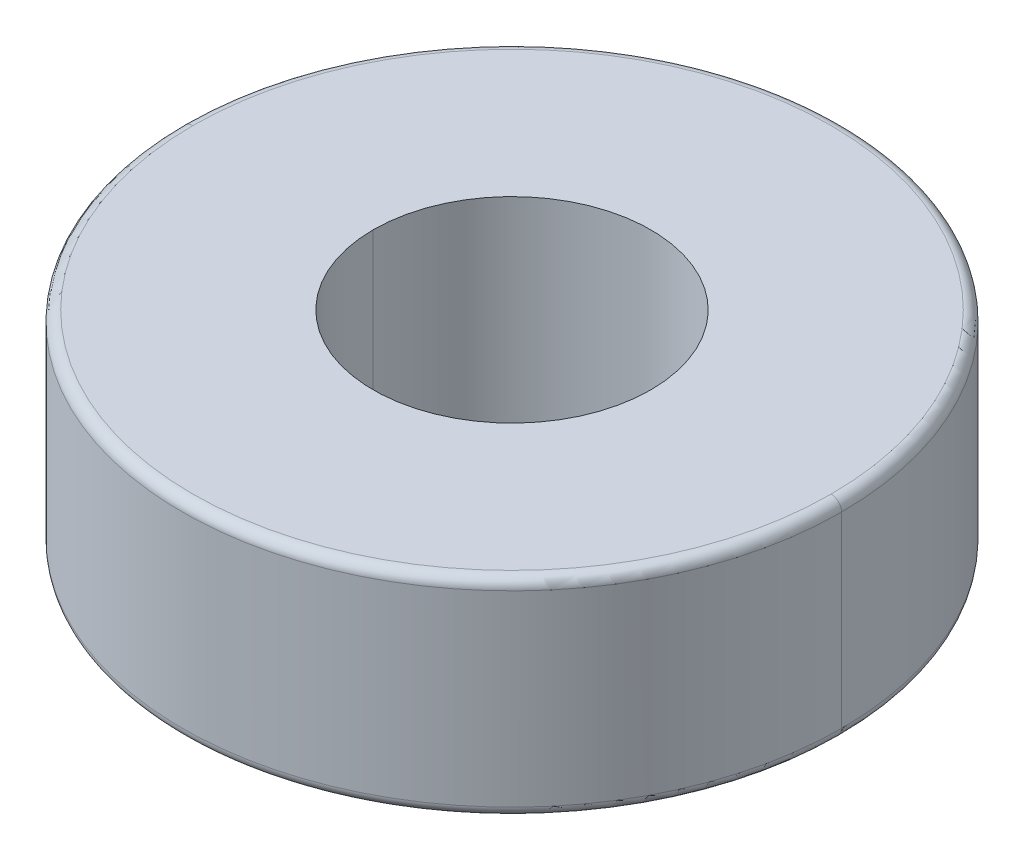
ISO-10303-21;
HEADER;
FILE_DESCRIPTION(('STEP AP214'),'2;1');
FILE_NAME('part.step','',(''),(''),'','','');
FILE_SCHEMA(('AUTOMOTIVE_DESIGN { 1 0 10303 214 1 1 1 1 }'));
ENDSEC;
DATA;
#1=APPLICATION_CONTEXT('core data for automotive mechanical design processes');
#2=APPLICATION_PROTOCOL_DEFINITION('international standard','automotive_design',2000,#1);
#3=PRODUCT_CONTEXT('',#1,'mechanical');
#4=PRODUCT('Part','Part','',(#3));
#5=PRODUCT_RELATED_PRODUCT_CATEGORY('part','',(#4));
#6=PRODUCT_DEFINITION_FORMATION('','',#4);
#7=PRODUCT_DEFINITION_CONTEXT('part definition',#1,'design');
#8=PRODUCT_DEFINITION('design','',#6,#7);
#9=PRODUCT_DEFINITION_SHAPE('','',#8);
#10=(LENGTH_UNIT() NAMED_UNIT(*) SI_UNIT(.MILLI.,.METRE.));
#11=(NAMED_UNIT(*) PLANE_ANGLE_UNIT() SI_UNIT($,.RADIAN.));
#12=(NAMED_UNIT(*) SI_UNIT($,.STERADIAN.) SOLID_ANGLE_UNIT());
#13=UNCERTAINTY_MEASURE_WITH_UNIT(LENGTH_MEASURE(1.E-05),#10,'distance_accuracy_value','');
#14=(GEOMETRIC_REPRESENTATION_CONTEXT(3) GLOBAL_UNCERTAINTY_ASSIGNED_CONTEXT((#13)) GLOBAL_UNIT_ASSIGNED_CONTEXT((#10,
#11,#12)) REPRESENTATION_CONTEXT('',''));
#15=CARTESIAN_POINT('',(0.,0.,0.));
#16=DIRECTION('',(0.,0.,1.));
#17=DIRECTION('',(1.,0.,0.));
#18=AXIS2_PLACEMENT_3D('',#15,#16,#17);
#19=CARTESIAN_POINT('',(0.,0.,0.));
#20=DIRECTION('',(0.,1.,0.));
#21=DIRECTION('',(1.,0.,0.));
#22=AXIS2_PLACEMENT_3D('',#19,#20,#21);
#23=PLANE('',#22);
#24=CARTESIAN_POINT('',(0.,0.,0.));
#25=DIRECTION('',(0.,1.,0.));
#26=DIRECTION('',(0.999979964590323,0.,-0.00633011989901915));
#27=AXIS2_PLACEMENT_3D('',#24,#25,#26);
#28=CIRCLE('',#27,9.2);
#29=CARTESIAN_POINT('',(9.199815674231,0.,-0.05823710307097));
#30=VERTEX_POINT('',#29);
#31=CARTESIAN_POINT('',(-9.2,0.,0.));
#32=VERTEX_POINT('',#31);
#33=EDGE_CURVE('E41',#30,#32,#28,.T.);
#34=ORIENTED_EDGE('',*,*,#33,.F.);
#35=CARTESIAN_POINT('',(0.,0.,0.));
#36=DIRECTION('',(0.,-1.,0.));
#37=DIRECTION('',(0.999979964590323,0.,-0.00633011989901915));
#38=AXIS2_PLACEMENT_3D('',#35,#36,#37);
#39=CIRCLE('',#38,9.2);
#40=CARTESIAN_POINT('',(9.2,0.,0.));
#41=VERTEX_POINT('',#40);
#42=EDGE_CURVE('E11',#30,#41,#39,.T.);
#43=ORIENTED_EDGE('',*,*,#42,.T.);
#44=CARTESIAN_POINT('',(0.,0.,0.));
#45=DIRECTION('',(0.,1.,0.));
#46=DIRECTION('',(-0.999979964590323,0.,0.00633011989901915));
#47=AXIS2_PLACEMENT_3D('',#44,#45,#46);
#48=CIRCLE('',#47,9.2);
#49=CARTESIAN_POINT('',(-9.199815674231,0.,0.05823710307097));
#50=VERTEX_POINT('',#49);
#51=EDGE_CURVE('E162',#50,#41,#48,.T.);
#52=ORIENTED_EDGE('',*,*,#51,.F.);
#53=CARTESIAN_POINT('',(0.,0.,0.));
#54=DIRECTION('',(0.,-1.,0.));
#55=DIRECTION('',(-0.999979964590323,0.,0.00633011989901915));
#56=AXIS2_PLACEMENT_3D('',#53,#54,#55);
#57=CIRCLE('',#56,9.2);
#58=EDGE_CURVE('E28',#50,#32,#57,.T.);
#59=ORIENTED_EDGE('',*,*,#58,.T.);
#60=EDGE_LOOP('',(#34,#43,#52,#59));
#61=FACE_BOUND('',#60,.T.);
#62=CARTESIAN_POINT('',(0.,0.,0.));
#63=DIRECTION('',(0.,-1.,0.));
#64=DIRECTION('',(-1.,0.,0.));
#65=AXIS2_PLACEMENT_3D('',#62,#63,#64);
#66=CIRCLE('',#65,4.);
#67=CARTESIAN_POINT('',(-4.,0.,0.));
#68=VERTEX_POINT('',#67);
#69=CARTESIAN_POINT('',(4.,0.,0.));
#70=VERTEX_POINT('',#69);
#71=EDGE_CURVE('E96',#68,#70,#66,.T.);
#72=ORIENTED_EDGE('',*,*,#71,.F.);
#73=CARTESIAN_POINT('',(0.,0.,0.));
#74=DIRECTION('',(0.,-1.,0.));
#75=DIRECTION('',(1.,0.,0.));
#76=AXIS2_PLACEMENT_3D('',#73,#74,#75);
#77=CIRCLE('',#76,4.);
#78=EDGE_CURVE('E198',#70,#68,#77,.T.);
#79=ORIENTED_EDGE('',*,*,#78,.F.);
#80=EDGE_LOOP('',(#72,#79));
#81=FACE_BOUND('',#80,.T.);
#82=ADVANCED_FACE('F17',(#61,#81),#23,.F.);
#83=CARTESIAN_POINT('',(0.,0.3,0.));
#84=DIRECTION('',(0.,1.,0.));
#85=DIRECTION('',(0.999979964313152,0.,-0.0063301636840707));
#86=AXIS2_PLACEMENT_3D('',#83,#84,#85);
#87=TOROIDAL_SURFACE('',#86,9.2,0.3);
#88=CARTESIAN_POINT('',(9.2,0.3,0.));
#89=DIRECTION('',(0.,0.,-1.));
#90=DIRECTION('',(1.,0.,0.));
#91=AXIS2_PLACEMENT_3D('',#88,#89,#90);
#92=CIRCLE('',#91,0.3);
#93=CARTESIAN_POINT('',(9.5,0.3,0.));
#94=VERTEX_POINT('',#93);
#95=EDGE_CURVE('E177',#94,#41,#92,.T.);
#96=ORIENTED_EDGE('',*,*,#95,.F.);
#97=CARTESIAN_POINT('',(0.,0.3,0.));
#98=DIRECTION('',(0.,1.,0.));
#99=DIRECTION('',(-0.999979964313152,0.,0.0063301636840697));
#100=AXIS2_PLACEMENT_3D('',#97,#98,#99);
#101=CIRCLE('',#100,9.5);
#102=CARTESIAN_POINT('',(-9.499809660975,0.3,0.06013655499867));
#103=VERTEX_POINT('',#102);
#104=EDGE_CURVE('E107',#103,#94,#101,.T.);
#105=ORIENTED_EDGE('',*,*,#104,.F.);
#106=CARTESIAN_POINT('',(0.,0.3,0.));
#107=DIRECTION('',(0.,1.,0.));
#108=DIRECTION('',(-1.,0.,0.));
#109=AXIS2_PLACEMENT_3D('',#106,#107,#108);
#110=CIRCLE('',#109,9.5);
#111=CARTESIAN_POINT('',(-9.5,0.3,1.125604273206E-13));
#112=VERTEX_POINT('',#111);
#113=EDGE_CURVE('E144',#112,#103,#110,.T.);
#114=ORIENTED_EDGE('',*,*,#113,.F.);
#115=CARTESIAN_POINT('',(-9.2,0.3,0.));
#116=DIRECTION('',(0.,0.,1.));
#117=DIRECTION('',(-1.,0.,0.));
#118=AXIS2_PLACEMENT_3D('',#115,#116,#117);
#119=CIRCLE('',#118,0.3);
#120=EDGE_CURVE('E148',#112,#32,#119,.T.);
#121=ORIENTED_EDGE('',*,*,#120,.T.);
#122=ORIENTED_EDGE('',*,*,#58,.F.);
#123=ORIENTED_EDGE('',*,*,#51,.T.);
#124=EDGE_LOOP('',(#96,#105,#114,#121,#122,#123));
#125=FACE_BOUND('',#124,.T.);
#126=ADVANCED_FACE('F146',(#125),#87,.T.);
#127=CARTESIAN_POINT('',(0.,0.3,0.));
#128=DIRECTION('',(0.,1.,0.));
#129=DIRECTION('',(-0.999979964313152,0.,0.0063301636840707));
#130=AXIS2_PLACEMENT_3D('',#127,#128,#129);
#131=TOROIDAL_SURFACE('',#130,9.2,0.3);
#132=ORIENTED_EDGE('',*,*,#120,.F.);
#133=CARTESIAN_POINT('',(0.,0.3,0.));
#134=DIRECTION('',(0.,1.,0.));
#135=DIRECTION('',(0.999979964313152,0.,-0.0063301636840697));
#136=AXIS2_PLACEMENT_3D('',#133,#134,#135);
#137=CIRCLE('',#136,9.5);
#138=CARTESIAN_POINT('',(9.499809660975,0.3,-0.06013655499867));
#139=VERTEX_POINT('',#138);
#140=EDGE_CURVE('E138',#139,#112,#137,.T.);
#141=ORIENTED_EDGE('',*,*,#140,.F.);
#142=CARTESIAN_POINT('',(0.,0.3,0.));
#143=DIRECTION('',(0.,1.,0.));
#144=DIRECTION('',(1.,0.,0.));
#145=AXIS2_PLACEMENT_3D('',#142,#143,#144);
#146=CIRCLE('',#145,9.5);
#147=EDGE_CURVE('E157',#94,#139,#146,.T.);
#148=ORIENTED_EDGE('',*,*,#147,.F.);
#149=ORIENTED_EDGE('',*,*,#95,.T.);
#150=ORIENTED_EDGE('',*,*,#42,.F.);
#151=ORIENTED_EDGE('',*,*,#33,.T.);
#152=EDGE_LOOP('',(#132,#141,#148,#149,#150,#151));
#153=FACE_BOUND('',#152,.T.);
#154=ADVANCED_FACE('F19',(#153),#131,.T.);
#155=CARTESIAN_POINT('',(0.,0.,0.));
#156=DIRECTION('',(0.,1.,0.));
#157=DIRECTION('',(1.,0.,0.));
#158=AXIS2_PLACEMENT_3D('',#155,#156,#157);
#159=CYLINDRICAL_SURFACE('',#158,9.5);
#160=DIRECTION('',(0.,-1.,0.));
#161=VECTOR('',#160,1.);
#162=CARTESIAN_POINT('',(9.5,5.7,0.));
#163=LINE('',#162,#161);
#164=CARTESIAN_POINT('',(9.5,5.7,0.));
#165=VERTEX_POINT('',#164);
#166=EDGE_CURVE('E184',#165,#94,#163,.T.);
#167=ORIENTED_EDGE('',*,*,#166,.T.);
#168=ORIENTED_EDGE('',*,*,#147,.T.);
#169=ORIENTED_EDGE('',*,*,#140,.T.);
#170=DIRECTION('',(0.,-1.,0.));
#171=VECTOR('',#170,1.);
#172=CARTESIAN_POINT('',(-9.5,5.7,1.091655734781E-13));
#173=LINE('',#172,#171);
#174=CARTESIAN_POINT('',(-9.5,5.7,2.224470607715E-13));
#175=VERTEX_POINT('',#174);
#176=EDGE_CURVE('E151',#175,#112,#173,.T.);
#177=ORIENTED_EDGE('',*,*,#176,.F.);
#178=CARTESIAN_POINT('',(0.,5.7,0.));
#179=DIRECTION('',(0.,-1.,0.));
#180=DIRECTION('',(-1.,0.,0.));
#181=AXIS2_PLACEMENT_3D('',#178,#179,#180);
#182=CIRCLE('',#181,9.5);
#183=CARTESIAN_POINT('',(-9.499905678201,5.7,-0.04233326440215));
#184=VERTEX_POINT('',#183);
#185=EDGE_CURVE('E159',#175,#184,#182,.T.);
#186=ORIENTED_EDGE('',*,*,#185,.T.);
#187=CARTESIAN_POINT('',(0.,5.7,0.));
#188=DIRECTION('',(0.,-1.,0.));
#189=DIRECTION('',(-0.999990071389631,0.,-0.00445613309496314));
#190=AXIS2_PLACEMENT_3D('',#187,#188,#189);
#191=CIRCLE('',#190,9.5);
#192=EDGE_CURVE('E185',#184,#165,#191,.T.);
#193=ORIENTED_EDGE('',*,*,#192,.T.);
#194=EDGE_LOOP('',(#167,#168,#169,#177,#186,#193));
#195=FACE_BOUND('',#194,.T.);
#196=ADVANCED_FACE('F155',(#195),#159,.T.);
#197=CARTESIAN_POINT('',(0.,5.7,0.));
#198=DIRECTION('',(0.,1.,0.));
#199=DIRECTION('',(0.999990071389631,0.,0.00445613309496314));
#200=AXIS2_PLACEMENT_3D('',#197,#198,#199);
#201=TOROIDAL_SURFACE('',#200,9.2,0.3);
#202=CARTESIAN_POINT('',(9.2,5.7,0.));
#203=DIRECTION('',(0.,0.,1.));
#204=DIRECTION('',(1.,0.,0.));
#205=AXIS2_PLACEMENT_3D('',#202,#203,#204);
#206=CIRCLE('',#205,0.3);
#207=CARTESIAN_POINT('',(9.2,6.,0.));
#208=VERTEX_POINT('',#207);
#209=EDGE_CURVE('E118',#165,#208,#206,.T.);
#210=ORIENTED_EDGE('',*,*,#209,.F.);
#211=ORIENTED_EDGE('',*,*,#192,.F.);
#212=ORIENTED_EDGE('',*,*,#185,.F.);
#213=CARTESIAN_POINT('',(-9.2,5.7,0.));
#214=DIRECTION('',(0.,0.,-1.));
#215=DIRECTION('',(-1.,0.,0.));
#216=AXIS2_PLACEMENT_3D('',#213,#214,#215);
#217=CIRCLE('',#216,0.3);
#218=CARTESIAN_POINT('',(-9.2,6.,0.));
#219=VERTEX_POINT('',#218);
#220=EDGE_CURVE('E188',#175,#219,#217,.T.);
#221=ORIENTED_EDGE('',*,*,#220,.T.);
#222=CARTESIAN_POINT('',(0.,6.,0.));
#223=DIRECTION('',(0.,1.,0.));
#224=DIRECTION('',(-0.999990071457696,0.,-0.00445611782073198));
#225=AXIS2_PLACEMENT_3D('',#222,#223,#224);
#226=CIRCLE('',#225,9.2);
#227=CARTESIAN_POINT('',(-9.199908657411,6.,-0.04099628395073));
#228=VERTEX_POINT('',#227);
#229=EDGE_CURVE('E130',#228,#219,#226,.T.);
#230=ORIENTED_EDGE('',*,*,#229,.F.);
#231=CARTESIAN_POINT('',(0.,6.,0.));
#232=DIRECTION('',(0.,-1.,0.));
#233=DIRECTION('',(-0.999990071457696,0.,-0.00445611782073198));
#234=AXIS2_PLACEMENT_3D('',#231,#232,#233);
#235=CIRCLE('',#234,9.2);
#236=EDGE_CURVE('E193',#228,#208,#235,.T.);
#237=ORIENTED_EDGE('',*,*,#236,.T.);
#238=EDGE_LOOP('',(#210,#211,#212,#221,#230,#237));
#239=FACE_BOUND('',#238,.T.);
#240=ADVANCED_FACE('F261',(#239),#201,.T.);
#241=CARTESIAN_POINT('',(0.,6.,0.));
#242=DIRECTION('',(0.,1.,0.));
#243=DIRECTION('',(1.,0.,0.));
#244=AXIS2_PLACEMENT_3D('',#241,#242,#243);
#245=PLANE('',#244);
#246=ORIENTED_EDGE('',*,*,#236,.F.);
#247=ORIENTED_EDGE('',*,*,#229,.T.);
#248=CARTESIAN_POINT('',(0.,6.,0.));
#249=DIRECTION('',(0.,-1.,0.));
#250=DIRECTION('',(0.999990071457696,0.,0.00445611782073198));
#251=AXIS2_PLACEMENT_3D('',#248,#249,#250);
#252=CIRCLE('',#251,9.2);
#253=CARTESIAN_POINT('',(9.199908657411,6.,0.04099628395073));
#254=VERTEX_POINT('',#253);
#255=EDGE_CURVE('E169',#254,#219,#252,.T.);
#256=ORIENTED_EDGE('',*,*,#255,.F.);
#257=CARTESIAN_POINT('',(0.,6.,0.));
#258=DIRECTION('',(0.,1.,0.));
#259=DIRECTION('',(0.999990071457696,0.,0.00445611782073198));
#260=AXIS2_PLACEMENT_3D('',#257,#258,#259);
#261=CIRCLE('',#260,9.2);
#262=EDGE_CURVE('E210',#254,#208,#261,.T.);
#263=ORIENTED_EDGE('',*,*,#262,.T.);
#264=EDGE_LOOP('',(#246,#247,#256,#263));
#265=FACE_BOUND('',#264,.T.);
#266=CARTESIAN_POINT('',(0.,6.,0.));
#267=DIRECTION('',(0.,1.,0.));
#268=DIRECTION('',(1.,0.,0.));
#269=AXIS2_PLACEMENT_3D('',#266,#267,#268);
#270=CIRCLE('',#269,4.);
#271=CARTESIAN_POINT('',(4.,6.,0.));
#272=VERTEX_POINT('',#271);
#273=CARTESIAN_POINT('',(-4.,6.,0.));
#274=VERTEX_POINT('',#273);
#275=EDGE_CURVE('E196',#272,#274,#270,.T.);
#276=ORIENTED_EDGE('',*,*,#275,.F.);
#277=CARTESIAN_POINT('',(0.,6.,0.));
#278=DIRECTION('',(0.,1.,0.));
#279=DIRECTION('',(-1.,0.,0.));
#280=AXIS2_PLACEMENT_3D('',#277,#278,#279);
#281=CIRCLE('',#280,4.);
#282=EDGE_CURVE('E200',#274,#272,#281,.T.);
#283=ORIENTED_EDGE('',*,*,#282,.F.);
#284=EDGE_LOOP('',(#276,#283));
#285=FACE_BOUND('',#284,.T.);
#286=ADVANCED_FACE('F256',(#265,#285),#245,.T.);
#287=CARTESIAN_POINT('',(0.,5.7,0.));
#288=DIRECTION('',(0.,1.,0.));
#289=DIRECTION('',(-0.999990071389631,0.,-0.00445613309496314));
#290=AXIS2_PLACEMENT_3D('',#287,#288,#289);
#291=TOROIDAL_SURFACE('',#290,9.2,0.3);
#292=ORIENTED_EDGE('',*,*,#220,.F.);
#293=CARTESIAN_POINT('',(0.,5.7,0.));
#294=DIRECTION('',(0.,-1.,0.));
#295=DIRECTION('',(0.999990071389631,0.,0.00445613309496414));
#296=AXIS2_PLACEMENT_3D('',#293,#294,#295);
#297=CIRCLE('',#296,9.5);
#298=CARTESIAN_POINT('',(9.499905678201,5.7,0.04233326440216));
#299=VERTEX_POINT('',#298);
#300=EDGE_CURVE('E167',#299,#175,#297,.T.);
#301=ORIENTED_EDGE('',*,*,#300,.F.);
#302=CARTESIAN_POINT('',(0.,5.7,0.));
#303=DIRECTION('',(0.,-1.,0.));
#304=DIRECTION('',(1.,0.,0.));
#305=AXIS2_PLACEMENT_3D('',#302,#303,#304);
#306=CIRCLE('',#305,9.5);
#307=EDGE_CURVE('E21',#165,#299,#306,.T.);
#308=ORIENTED_EDGE('',*,*,#307,.F.);
#309=ORIENTED_EDGE('',*,*,#209,.T.);
#310=ORIENTED_EDGE('',*,*,#262,.F.);
#311=ORIENTED_EDGE('',*,*,#255,.T.);
#312=EDGE_LOOP('',(#292,#301,#308,#309,#310,#311));
#313=FACE_BOUND('',#312,.T.);
#314=ADVANCED_FACE('F236',(#313),#291,.T.);
#315=CARTESIAN_POINT('',(0.,0.,0.));
#316=DIRECTION('',(0.,1.,0.));
#317=DIRECTION('',(1.,0.,0.));
#318=AXIS2_PLACEMENT_3D('',#315,#316,#317);
#319=CYLINDRICAL_SURFACE('',#318,9.5);
#320=ORIENTED_EDGE('',*,*,#176,.T.);
#321=ORIENTED_EDGE('',*,*,#113,.T.);
#322=ORIENTED_EDGE('',*,*,#104,.T.);
#323=ORIENTED_EDGE('',*,*,#166,.F.);
#324=ORIENTED_EDGE('',*,*,#307,.T.);
#325=ORIENTED_EDGE('',*,*,#300,.T.);
#326=EDGE_LOOP('',(#320,#321,#322,#323,#324,#325));
#327=FACE_BOUND('',#326,.T.);
#328=ADVANCED_FACE('F165',(#327),#319,.T.);
#329=CARTESIAN_POINT('',(0.,0.,0.));
#330=DIRECTION('',(0.,1.,0.));
#331=DIRECTION('',(1.,0.,0.));
#332=AXIS2_PLACEMENT_3D('',#329,#330,#331);
#333=CYLINDRICAL_SURFACE('',#332,4.);
#334=DIRECTION('',(0.,-1.,0.));
#335=VECTOR('',#334,1.);
#336=CARTESIAN_POINT('',(-4.,6.,0.));
#337=LINE('',#336,#335);
#338=EDGE_CURVE('E181',#274,#68,#337,.T.);
#339=ORIENTED_EDGE('',*,*,#338,.F.);
#340=ORIENTED_EDGE('',*,*,#282,.T.);
#341=DIRECTION('',(0.,-1.,0.));
#342=VECTOR('',#341,1.);
#343=CARTESIAN_POINT('',(4.,6.,0.));
#344=LINE('',#343,#342);
#345=EDGE_CURVE('E204',#272,#70,#344,.T.);
#346=ORIENTED_EDGE('',*,*,#345,.T.);
#347=ORIENTED_EDGE('',*,*,#78,.T.);
#348=EDGE_LOOP('',(#339,#340,#346,#347));
#349=FACE_BOUND('',#348,.T.);
#350=ADVANCED_FACE('F242',(#349),#333,.F.);
#351=CARTESIAN_POINT('',(0.,0.,0.));
#352=DIRECTION('',(0.,1.,0.));
#353=DIRECTION('',(1.,0.,0.));
#354=AXIS2_PLACEMENT_3D('',#351,#352,#353);
#355=CYLINDRICAL_SURFACE('',#354,4.);
#356=ORIENTED_EDGE('',*,*,#345,.F.);
#357=ORIENTED_EDGE('',*,*,#275,.T.);
#358=ORIENTED_EDGE('',*,*,#338,.T.);
#359=ORIENTED_EDGE('',*,*,#71,.T.);
#360=EDGE_LOOP('',(#356,#357,#358,#359));
#361=FACE_BOUND('',#360,.T.);
#362=ADVANCED_FACE('F247',(#361),#355,.F.);
#363=CLOSED_SHELL('',(#82,#126,#154,#196,#240,#286,#314,#328,#350,#362));
#364=MANIFOLD_SOLID_BREP('B1',#363);
#365=ADVANCED_BREP_SHAPE_REPRESENTATION('',(#18,#364),#14);
#366=SHAPE_DEFINITION_REPRESENTATION(#9,#365);
ENDSEC;
END-ISO-10303-21;
